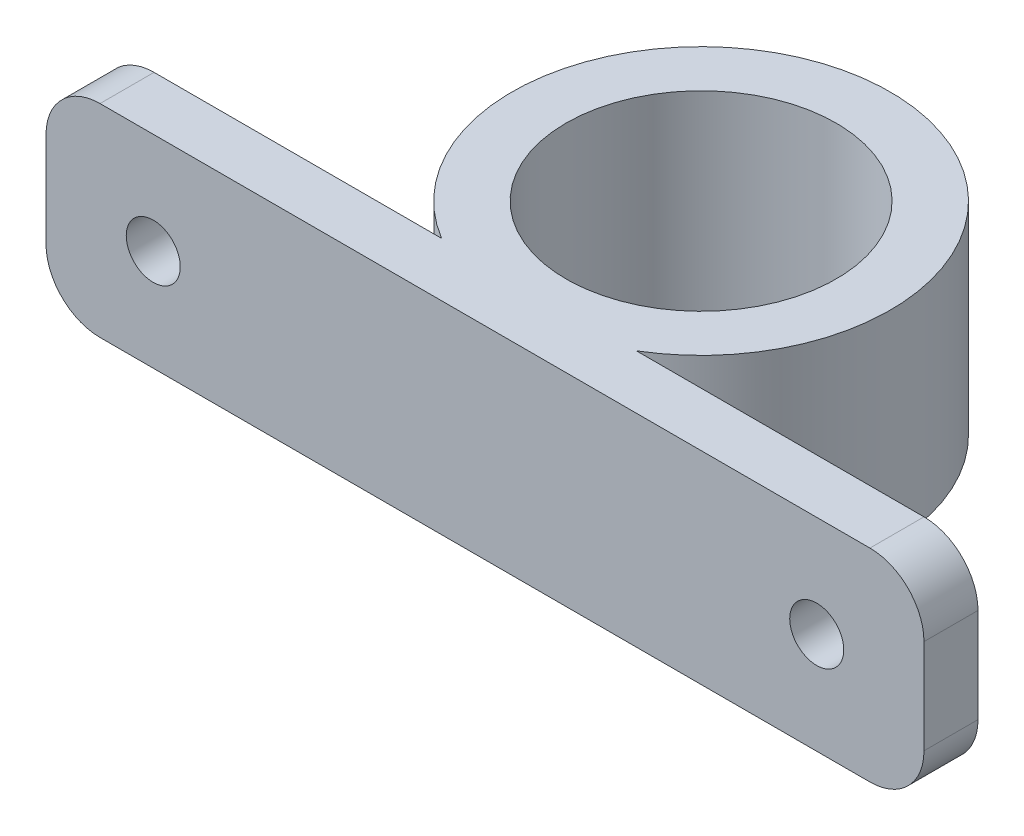
ISO-10303-21;
HEADER;
FILE_DESCRIPTION(('STEP AP214'),'2;1');
FILE_NAME('part.step','',(''),(''),'','','');
FILE_SCHEMA(('AUTOMOTIVE_DESIGN { 1 0 10303 214 1 1 1 1 }'));
ENDSEC;
DATA;
#1=APPLICATION_CONTEXT('core data for automotive mechanical design processes');
#2=APPLICATION_PROTOCOL_DEFINITION('international standard','automotive_design',2000,#1);
#3=PRODUCT_CONTEXT('',#1,'mechanical');
#4=PRODUCT('Part','Part','',(#3));
#5=PRODUCT_RELATED_PRODUCT_CATEGORY('part','',(#4));
#6=PRODUCT_DEFINITION_FORMATION('','',#4);
#7=PRODUCT_DEFINITION_CONTEXT('part definition',#1,'design');
#8=PRODUCT_DEFINITION('design','',#6,#7);
#9=PRODUCT_DEFINITION_SHAPE('','',#8);
#10=(LENGTH_UNIT() NAMED_UNIT(*) SI_UNIT(.MILLI.,.METRE.));
#11=(NAMED_UNIT(*) PLANE_ANGLE_UNIT() SI_UNIT($,.RADIAN.));
#12=(NAMED_UNIT(*) SI_UNIT($,.STERADIAN.) SOLID_ANGLE_UNIT());
#13=UNCERTAINTY_MEASURE_WITH_UNIT(LENGTH_MEASURE(1.E-05),#10,'distance_accuracy_value','');
#14=(GEOMETRIC_REPRESENTATION_CONTEXT(3) GLOBAL_UNCERTAINTY_ASSIGNED_CONTEXT((#13)) GLOBAL_UNIT_ASSIGNED_CONTEXT((#10,
#11,#12)) REPRESENTATION_CONTEXT('',''));
#15=CARTESIAN_POINT('',(0.,0.,0.));
#16=DIRECTION('',(0.,0.,1.));
#17=DIRECTION('',(1.,0.,0.));
#18=AXIS2_PLACEMENT_3D('',#15,#16,#17);
#19=CARTESIAN_POINT('',(0.,0.,0.));
#20=DIRECTION('',(0.,0.,-1.));
#21=DIRECTION('',(-1.,0.,0.));
#22=AXIS2_PLACEMENT_3D('',#19,#20,#21);
#23=PLANE('',#22);
#24=CARTESIAN_POINT('',(-12.28,0.,0.));
#25=DIRECTION('',(0.,0.,-1.));
#26=DIRECTION('',(-1.,0.,0.));
#27=AXIS2_PLACEMENT_3D('',#24,#25,#26);
#28=CIRCLE('',#27,1.);
#29=CARTESIAN_POINT('',(-13.28,0.,0.));
#30=VERTEX_POINT('',#29);
#31=EDGE_CURVE('E233',#30,#30,#28,.T.);
#32=ORIENTED_EDGE('',*,*,#31,.F.);
#33=EDGE_LOOP('',(#32));
#34=FACE_BOUND('',#33,.T.);
#35=DIRECTION('',(1.,0.,0.));
#36=VECTOR('',#35,1.);
#37=CARTESIAN_POINT('',(16.25,-3.75,0.));
#38=LINE('',#37,#36);
#39=CARTESIAN_POINT('',(-14.25,-3.75,0.));
#40=VERTEX_POINT('',#39);
#41=CARTESIAN_POINT('',(-3.60555127546398,-3.75,0.));
#42=VERTEX_POINT('',#41);
#43=EDGE_CURVE('E194',#40,#42,#38,.T.);
#44=ORIENTED_EDGE('',*,*,#43,.F.);
#45=CARTESIAN_POINT('',(-14.25,-1.75,0.));
#46=DIRECTION('',(0.,0.,-1.));
#47=DIRECTION('',(-1.,0.,0.));
#48=AXIS2_PLACEMENT_3D('',#45,#46,#47);
#49=CIRCLE('',#48,2.);
#50=CARTESIAN_POINT('',(-16.25,-1.75,0.));
#51=VERTEX_POINT('',#50);
#52=EDGE_CURVE('E54',#40,#51,#49,.T.);
#53=ORIENTED_EDGE('',*,*,#52,.T.);
#54=DIRECTION('',(0.,-1.,0.));
#55=VECTOR('',#54,1.);
#56=CARTESIAN_POINT('',(-16.25,3.75,0.));
#57=LINE('',#56,#55);
#58=CARTESIAN_POINT('',(-16.25,1.75,0.));
#59=VERTEX_POINT('',#58);
#60=EDGE_CURVE('E189',#59,#51,#57,.T.);
#61=ORIENTED_EDGE('',*,*,#60,.F.);
#62=CARTESIAN_POINT('',(-14.25,1.75,0.));
#63=DIRECTION('',(0.,0.,-1.));
#64=DIRECTION('',(-1.,0.,0.));
#65=AXIS2_PLACEMENT_3D('',#62,#63,#64);
#66=CIRCLE('',#65,2.);
#67=CARTESIAN_POINT('',(-14.25,3.75,0.));
#68=VERTEX_POINT('',#67);
#69=EDGE_CURVE('E62',#59,#68,#66,.T.);
#70=ORIENTED_EDGE('',*,*,#69,.T.);
#71=DIRECTION('',(-1.,0.,0.));
#72=VECTOR('',#71,1.);
#73=CARTESIAN_POINT('',(16.25,3.75,0.));
#74=LINE('',#73,#72);
#75=CARTESIAN_POINT('',(-3.60555127546398,3.75,0.));
#76=VERTEX_POINT('',#75);
#77=EDGE_CURVE('E130',#76,#68,#74,.T.);
#78=ORIENTED_EDGE('',*,*,#77,.F.);
#79=DIRECTION('',(0.,1.,0.));
#80=VECTOR('',#79,1.);
#81=CARTESIAN_POINT('',(-3.60555127546398,-3.75,0.));
#82=LINE('',#81,#80);
#83=EDGE_CURVE('E138',#42,#76,#82,.T.);
#84=ORIENTED_EDGE('',*,*,#83,.F.);
#85=EDGE_LOOP('',(#44,#53,#61,#70,#78,#84));
#86=FACE_BOUND('',#85,.T.);
#87=ADVANCED_FACE('F39',(#34,#86),#23,.T.);
#88=CARTESIAN_POINT('',(-16.25,3.75,2.));
#89=DIRECTION('',(1.,0.,0.));
#90=DIRECTION('',(0.,1.,0.));
#91=AXIS2_PLACEMENT_3D('',#88,#89,#90);
#92=PLANE('',#91);
#93=ORIENTED_EDGE('',*,*,#60,.T.);
#94=DIRECTION('',(0.,0.,-1.));
#95=VECTOR('',#94,1.);
#96=CARTESIAN_POINT('',(-16.25,-1.75,2.));
#97=LINE('',#96,#95);
#98=CARTESIAN_POINT('',(-16.25,-1.75,2.));
#99=VERTEX_POINT('',#98);
#100=EDGE_CURVE('E11',#51,#99,#97,.F.);
#101=ORIENTED_EDGE('',*,*,#100,.T.);
#102=DIRECTION('',(0.,-1.,0.));
#103=VECTOR('',#102,1.);
#104=CARTESIAN_POINT('',(-16.25,3.75,2.));
#105=LINE('',#104,#103);
#106=CARTESIAN_POINT('',(-16.25,1.75,2.));
#107=VERTEX_POINT('',#106);
#108=EDGE_CURVE('E129',#107,#99,#105,.T.);
#109=ORIENTED_EDGE('',*,*,#108,.F.);
#110=DIRECTION('',(0.,0.,-1.));
#111=VECTOR('',#110,1.);
#112=CARTESIAN_POINT('',(-16.25,1.75,2.));
#113=LINE('',#112,#111);
#114=EDGE_CURVE('E47',#107,#59,#113,.T.);
#115=ORIENTED_EDGE('',*,*,#114,.T.);
#116=EDGE_LOOP('',(#93,#101,#109,#115));
#117=FACE_BOUND('',#116,.T.);
#118=ADVANCED_FACE('F188',(#117),#92,.F.);
#119=CARTESIAN_POINT('',(16.25,-3.75,2.));
#120=DIRECTION('',(0.,1.,0.));
#121=DIRECTION('',(-1.,0.,0.));
#122=AXIS2_PLACEMENT_3D('',#119,#120,#121);
#123=PLANE('',#122);
#124=CARTESIAN_POINT('',(3.60555127546398,-3.75,0.));
#125=VERTEX_POINT('',#124);
#126=CARTESIAN_POINT('',(14.25,-3.75,0.));
#127=VERTEX_POINT('',#126);
#128=EDGE_CURVE('E146',#125,#127,#38,.T.);
#129=ORIENTED_EDGE('',*,*,#128,.T.);
#130=DIRECTION('',(0.,0.,-1.));
#131=VECTOR('',#130,1.);
#132=CARTESIAN_POINT('',(14.25,-3.75,2.));
#133=LINE('',#132,#131);
#134=CARTESIAN_POINT('',(14.25,-3.75,2.));
#135=VERTEX_POINT('',#134);
#136=EDGE_CURVE('E183',#127,#135,#133,.F.);
#137=ORIENTED_EDGE('',*,*,#136,.T.);
#138=DIRECTION('',(1.,0.,0.));
#139=VECTOR('',#138,1.);
#140=CARTESIAN_POINT('',(16.25,-3.75,2.));
#141=LINE('',#140,#139);
#142=CARTESIAN_POINT('',(-14.25,-3.75,2.));
#143=VERTEX_POINT('',#142);
#144=EDGE_CURVE('E221',#143,#135,#141,.T.);
#145=ORIENTED_EDGE('',*,*,#144,.F.);
#146=DIRECTION('',(0.,0.,-1.));
#147=VECTOR('',#146,1.);
#148=CARTESIAN_POINT('',(-14.25,-3.75,2.));
#149=LINE('',#148,#147);
#150=EDGE_CURVE('E180',#143,#40,#149,.T.);
#151=ORIENTED_EDGE('',*,*,#150,.T.);
#152=ORIENTED_EDGE('',*,*,#43,.T.);
#153=CARTESIAN_POINT('',(0.,-3.75,-6.));
#154=DIRECTION('',(0.,1.,0.));
#155=DIRECTION('',(-1.,0.,0.));
#156=AXIS2_PLACEMENT_3D('',#153,#154,#155);
#157=CIRCLE('',#156,7.);
#158=EDGE_CURVE('E140',#125,#42,#157,.T.);
#159=ORIENTED_EDGE('',*,*,#158,.F.);
#160=EDGE_LOOP('',(#129,#137,#145,#151,#152,#159));
#161=FACE_BOUND('',#160,.T.);
#162=CARTESIAN_POINT('',(0.,-3.75,-6.));
#163=DIRECTION('',(0.,1.,0.));
#164=DIRECTION('',(-1.,0.,0.));
#165=AXIS2_PLACEMENT_3D('',#162,#163,#164);
#166=CIRCLE('',#165,5.);
#167=CARTESIAN_POINT('',(-5.,-3.75,-6.));
#168=VERTEX_POINT('',#167);
#169=EDGE_CURVE('E141',#168,#168,#166,.T.);
#170=ORIENTED_EDGE('',*,*,#169,.T.);
#171=EDGE_LOOP('',(#170));
#172=FACE_BOUND('',#171,.T.);
#173=ADVANCED_FACE('F214',(#161,#172),#123,.F.);
#174=CARTESIAN_POINT('',(16.25,3.75,2.));
#175=DIRECTION('',(-1.,0.,0.));
#176=DIRECTION('',(0.,0.,1.));
#177=AXIS2_PLACEMENT_3D('',#174,#175,#176);
#178=PLANE('',#177);
#179=DIRECTION('',(0.,1.,0.));
#180=VECTOR('',#179,1.);
#181=CARTESIAN_POINT('',(16.25,3.75,0.));
#182=LINE('',#181,#180);
#183=CARTESIAN_POINT('',(16.25,-1.75,0.));
#184=VERTEX_POINT('',#183);
#185=CARTESIAN_POINT('',(16.25,1.75,0.));
#186=VERTEX_POINT('',#185);
#187=EDGE_CURVE('E198',#184,#186,#182,.T.);
#188=ORIENTED_EDGE('',*,*,#187,.T.);
#189=DIRECTION('',(0.,0.,-1.));
#190=VECTOR('',#189,1.);
#191=CARTESIAN_POINT('',(16.25,1.75,2.));
#192=LINE('',#191,#190);
#193=CARTESIAN_POINT('',(16.25,1.75,2.));
#194=VERTEX_POINT('',#193);
#195=EDGE_CURVE('E170',#186,#194,#192,.F.);
#196=ORIENTED_EDGE('',*,*,#195,.T.);
#197=DIRECTION('',(0.,1.,0.));
#198=VECTOR('',#197,1.);
#199=CARTESIAN_POINT('',(16.25,3.75,2.));
#200=LINE('',#199,#198);
#201=CARTESIAN_POINT('',(16.25,-1.75,2.));
#202=VERTEX_POINT('',#201);
#203=EDGE_CURVE('E152',#202,#194,#200,.T.);
#204=ORIENTED_EDGE('',*,*,#203,.F.);
#205=DIRECTION('',(0.,0.,-1.));
#206=VECTOR('',#205,1.);
#207=CARTESIAN_POINT('',(16.25,-1.75,2.));
#208=LINE('',#207,#206);
#209=EDGE_CURVE('E167',#202,#184,#208,.T.);
#210=ORIENTED_EDGE('',*,*,#209,.T.);
#211=EDGE_LOOP('',(#188,#196,#204,#210));
#212=FACE_BOUND('',#211,.T.);
#213=ADVANCED_FACE('F222',(#212),#178,.F.);
#214=CARTESIAN_POINT('',(16.25,3.75,2.));
#215=DIRECTION('',(0.,-1.,0.));
#216=DIRECTION('',(1.,0.,0.));
#217=AXIS2_PLACEMENT_3D('',#214,#215,#216);
#218=PLANE('',#217);
#219=DIRECTION('',(-1.,0.,0.));
#220=VECTOR('',#219,1.);
#221=CARTESIAN_POINT('',(16.25,3.75,2.));
#222=LINE('',#221,#220);
#223=CARTESIAN_POINT('',(14.25,3.75,2.));
#224=VERTEX_POINT('',#223);
#225=CARTESIAN_POINT('',(-14.25,3.75,2.));
#226=VERTEX_POINT('',#225);
#227=EDGE_CURVE('E147',#224,#226,#222,.T.);
#228=ORIENTED_EDGE('',*,*,#227,.F.);
#229=DIRECTION('',(0.,0.,-1.));
#230=VECTOR('',#229,1.);
#231=CARTESIAN_POINT('',(14.25,3.75,2.));
#232=LINE('',#231,#230);
#233=CARTESIAN_POINT('',(14.25,3.75,0.));
#234=VERTEX_POINT('',#233);
#235=EDGE_CURVE('E126',#224,#234,#232,.T.);
#236=ORIENTED_EDGE('',*,*,#235,.T.);
#237=CARTESIAN_POINT('',(3.60555127546398,3.75,0.));
#238=VERTEX_POINT('',#237);
#239=EDGE_CURVE('E117',#234,#238,#74,.T.);
#240=ORIENTED_EDGE('',*,*,#239,.T.);
#241=CARTESIAN_POINT('',(0.,3.75,-6.));
#242=DIRECTION('',(0.,1.,0.));
#243=DIRECTION('',(-1.,0.,0.));
#244=AXIS2_PLACEMENT_3D('',#241,#242,#243);
#245=CIRCLE('',#244,7.);
#246=EDGE_CURVE('E123',#238,#76,#245,.T.);
#247=ORIENTED_EDGE('',*,*,#246,.T.);
#248=ORIENTED_EDGE('',*,*,#77,.T.);
#249=DIRECTION('',(0.,0.,-1.));
#250=VECTOR('',#249,1.);
#251=CARTESIAN_POINT('',(-14.25,3.75,2.));
#252=LINE('',#251,#250);
#253=EDGE_CURVE('E149',#68,#226,#252,.F.);
#254=ORIENTED_EDGE('',*,*,#253,.T.);
#255=EDGE_LOOP('',(#228,#236,#240,#247,#248,#254));
#256=FACE_BOUND('',#255,.T.);
#257=CARTESIAN_POINT('',(0.,3.75,-6.));
#258=DIRECTION('',(0.,1.,0.));
#259=DIRECTION('',(-1.,0.,0.));
#260=AXIS2_PLACEMENT_3D('',#257,#258,#259);
#261=CIRCLE('',#260,5.);
#262=CARTESIAN_POINT('',(-5.,3.75,-6.));
#263=VERTEX_POINT('',#262);
#264=EDGE_CURVE('E159',#263,#263,#261,.T.);
#265=ORIENTED_EDGE('',*,*,#264,.F.);
#266=EDGE_LOOP('',(#265));
#267=FACE_BOUND('',#266,.T.);
#268=ADVANCED_FACE('F120',(#256,#267),#218,.F.);
#269=CARTESIAN_POINT('',(0.,0.,2.));
#270=DIRECTION('',(0.,0.,-1.));
#271=DIRECTION('',(-1.,0.,0.));
#272=AXIS2_PLACEMENT_3D('',#269,#270,#271);
#273=PLANE('',#272);
#274=CARTESIAN_POINT('',(12.28,0.,2.));
#275=DIRECTION('',(0.,0.,-1.));
#276=DIRECTION('',(-1.,0.,0.));
#277=AXIS2_PLACEMENT_3D('',#274,#275,#276);
#278=CIRCLE('',#277,1.);
#279=CARTESIAN_POINT('',(11.28,0.,2.));
#280=VERTEX_POINT('',#279);
#281=EDGE_CURVE('E160',#280,#280,#278,.T.);
#282=ORIENTED_EDGE('',*,*,#281,.T.);
#283=EDGE_LOOP('',(#282));
#284=FACE_BOUND('',#283,.T.);
#285=CARTESIAN_POINT('',(-12.28,0.,2.));
#286=DIRECTION('',(0.,0.,-1.));
#287=DIRECTION('',(-1.,0.,0.));
#288=AXIS2_PLACEMENT_3D('',#285,#286,#287);
#289=CIRCLE('',#288,1.);
#290=CARTESIAN_POINT('',(-13.28,0.,2.));
#291=VERTEX_POINT('',#290);
#292=EDGE_CURVE('E156',#291,#291,#289,.T.);
#293=ORIENTED_EDGE('',*,*,#292,.T.);
#294=EDGE_LOOP('',(#293));
#295=FACE_BOUND('',#294,.T.);
#296=ORIENTED_EDGE('',*,*,#203,.T.);
#297=CARTESIAN_POINT('',(14.25,1.75,2.));
#298=DIRECTION('',(0.,0.,-1.));
#299=DIRECTION('',(-1.,0.,0.));
#300=AXIS2_PLACEMENT_3D('',#297,#298,#299);
#301=CIRCLE('',#300,2.);
#302=EDGE_CURVE('E178',#194,#224,#301,.F.);
#303=ORIENTED_EDGE('',*,*,#302,.T.);
#304=ORIENTED_EDGE('',*,*,#227,.T.);
#305=CARTESIAN_POINT('',(-14.25,1.75,2.));
#306=DIRECTION('',(0.,0.,-1.));
#307=DIRECTION('',(-1.,0.,0.));
#308=AXIS2_PLACEMENT_3D('',#305,#306,#307);
#309=CIRCLE('',#308,2.);
#310=EDGE_CURVE('E172',#226,#107,#309,.F.);
#311=ORIENTED_EDGE('',*,*,#310,.T.);
#312=ORIENTED_EDGE('',*,*,#108,.T.);
#313=CARTESIAN_POINT('',(-14.25,-1.75,2.));
#314=DIRECTION('',(0.,0.,-1.));
#315=DIRECTION('',(-1.,0.,0.));
#316=AXIS2_PLACEMENT_3D('',#313,#314,#315);
#317=CIRCLE('',#316,2.);
#318=EDGE_CURVE('E174',#99,#143,#317,.F.);
#319=ORIENTED_EDGE('',*,*,#318,.T.);
#320=ORIENTED_EDGE('',*,*,#144,.T.);
#321=CARTESIAN_POINT('',(14.25,-1.75,2.));
#322=DIRECTION('',(0.,0.,-1.));
#323=DIRECTION('',(-1.,0.,0.));
#324=AXIS2_PLACEMENT_3D('',#321,#322,#323);
#325=CIRCLE('',#324,2.);
#326=EDGE_CURVE('E176',#135,#202,#325,.F.);
#327=ORIENTED_EDGE('',*,*,#326,.T.);
#328=EDGE_LOOP('',(#296,#303,#304,#311,#312,#319,#320,#327));
#329=FACE_BOUND('',#328,.T.);
#330=ADVANCED_FACE('F205',(#284,#295,#329),#273,.F.);
#331=CARTESIAN_POINT('',(12.28,0.,0.));
#332=DIRECTION('',(0.,0.,-1.));
#333=DIRECTION('',(-1.,0.,0.));
#334=AXIS2_PLACEMENT_3D('',#331,#332,#333);
#335=CIRCLE('',#334,1.);
#336=CARTESIAN_POINT('',(11.28,0.,0.));
#337=VERTEX_POINT('',#336);
#338=EDGE_CURVE('E232',#337,#337,#335,.T.);
#339=ORIENTED_EDGE('',*,*,#338,.F.);
#340=EDGE_LOOP('',(#339));
#341=FACE_BOUND('',#340,.T.);
#342=ORIENTED_EDGE('',*,*,#239,.F.);
#343=CARTESIAN_POINT('',(14.25,1.75,0.));
#344=DIRECTION('',(0.,0.,-1.));
#345=DIRECTION('',(-1.,0.,0.));
#346=AXIS2_PLACEMENT_3D('',#343,#344,#345);
#347=CIRCLE('',#346,2.);
#348=EDGE_CURVE('E165',#234,#186,#347,.T.);
#349=ORIENTED_EDGE('',*,*,#348,.T.);
#350=ORIENTED_EDGE('',*,*,#187,.F.);
#351=CARTESIAN_POINT('',(14.25,-1.75,0.));
#352=DIRECTION('',(0.,0.,-1.));
#353=DIRECTION('',(-1.,0.,0.));
#354=AXIS2_PLACEMENT_3D('',#351,#352,#353);
#355=CIRCLE('',#354,2.);
#356=EDGE_CURVE('E163',#184,#127,#355,.T.);
#357=ORIENTED_EDGE('',*,*,#356,.T.);
#358=ORIENTED_EDGE('',*,*,#128,.F.);
#359=DIRECTION('',(0.,1.,0.));
#360=VECTOR('',#359,1.);
#361=CARTESIAN_POINT('',(3.60555127546398,-3.75,0.));
#362=LINE('',#361,#360);
#363=EDGE_CURVE('E135',#238,#125,#362,.F.);
#364=ORIENTED_EDGE('',*,*,#363,.F.);
#365=EDGE_LOOP('',(#342,#349,#350,#357,#358,#364));
#366=FACE_BOUND('',#365,.T.);
#367=ADVANCED_FACE('F144',(#341,#366),#23,.T.);
#368=CARTESIAN_POINT('',(0.,-3.75,-6.));
#369=DIRECTION('',(0.,1.,0.));
#370=DIRECTION('',(-1.,0.,0.));
#371=AXIS2_PLACEMENT_3D('',#368,#369,#370);
#372=CYLINDRICAL_SURFACE('',#371,7.);
#373=ORIENTED_EDGE('',*,*,#158,.T.);
#374=ORIENTED_EDGE('',*,*,#83,.T.);
#375=ORIENTED_EDGE('',*,*,#246,.F.);
#376=ORIENTED_EDGE('',*,*,#363,.T.);
#377=EDGE_LOOP('',(#373,#374,#375,#376));
#378=FACE_BOUND('',#377,.T.);
#379=ADVANCED_FACE('F134',(#378),#372,.T.);
#380=CARTESIAN_POINT('',(0.,-3.75,-6.));
#381=DIRECTION('',(0.,1.,0.));
#382=DIRECTION('',(-1.,0.,0.));
#383=AXIS2_PLACEMENT_3D('',#380,#381,#382);
#384=CYLINDRICAL_SURFACE('',#383,5.);
#385=ORIENTED_EDGE('',*,*,#169,.F.);
#386=EDGE_LOOP('',(#385));
#387=FACE_BOUND('',#386,.T.);
#388=ORIENTED_EDGE('',*,*,#264,.T.);
#389=EDGE_LOOP('',(#388));
#390=FACE_BOUND('',#389,.T.);
#391=ADVANCED_FACE('F248',(#387,#390),#384,.F.);
#392=CARTESIAN_POINT('',(12.28,0.,3.18));
#393=DIRECTION('',(0.,0.,-1.));
#394=DIRECTION('',(-1.,0.,0.));
#395=AXIS2_PLACEMENT_3D('',#392,#393,#394);
#396=CYLINDRICAL_SURFACE('',#395,1.);
#397=CARTESIAN_POINT('',(11.28,0.,0.));
#398=CARTESIAN_POINT('',(11.28,0.,0.0208333333333333));
#399=CARTESIAN_POINT('',(11.28,0.,0.0416666666666667));
#400=CARTESIAN_POINT('',(11.28,0.,0.0833333333333334));
#401=CARTESIAN_POINT('',(11.28,0.,0.104166666666667));
#402=CARTESIAN_POINT('',(11.28,0.,0.145833333333333));
#403=CARTESIAN_POINT('',(11.28,0.,0.166666666666667));
#404=CARTESIAN_POINT('',(11.28,0.,0.208333333333334));
#405=CARTESIAN_POINT('',(11.28,0.,0.229166666666667));
#406=CARTESIAN_POINT('',(11.28,0.,0.270833333333334));
#407=CARTESIAN_POINT('',(11.28,0.,0.291666666666667));
#408=CARTESIAN_POINT('',(11.28,0.,0.333333333333334));
#409=CARTESIAN_POINT('',(11.28,0.,0.354166666666667));
#410=CARTESIAN_POINT('',(11.28,0.,0.395833333333334));
#411=CARTESIAN_POINT('',(11.28,0.,0.416666666666667));
#412=CARTESIAN_POINT('',(11.28,0.,0.458333333333333));
#413=CARTESIAN_POINT('',(11.28,0.,0.479166666666667));
#414=CARTESIAN_POINT('',(11.28,0.,0.520833333333333));
#415=CARTESIAN_POINT('',(11.28,0.,0.541666666666667));
#416=CARTESIAN_POINT('',(11.28,0.,0.583333333333333));
#417=CARTESIAN_POINT('',(11.28,0.,0.604166666666667));
#418=CARTESIAN_POINT('',(11.28,0.,0.645833333333333));
#419=CARTESIAN_POINT('',(11.28,0.,0.666666666666667));
#420=CARTESIAN_POINT('',(11.28,0.,0.708333333333333));
#421=CARTESIAN_POINT('',(11.28,0.,0.729166666666667));
#422=CARTESIAN_POINT('',(11.28,0.,0.770833333333334));
#423=CARTESIAN_POINT('',(11.28,0.,0.791666666666667));
#424=CARTESIAN_POINT('',(11.28,0.,0.833333333333334));
#425=CARTESIAN_POINT('',(11.28,0.,0.854166666666667));
#426=CARTESIAN_POINT('',(11.28,0.,0.895833333333334));
#427=CARTESIAN_POINT('',(11.28,0.,0.916666666666667));
#428=CARTESIAN_POINT('',(11.28,0.,0.958333333333333));
#429=CARTESIAN_POINT('',(11.28,0.,0.979166666666667));
#430=CARTESIAN_POINT('',(11.28,0.,1.02083333333333));
#431=CARTESIAN_POINT('',(11.28,0.,1.04166666666667));
#432=CARTESIAN_POINT('',(11.28,0.,1.08333333333333));
#433=CARTESIAN_POINT('',(11.28,0.,1.10416666666667));
#434=CARTESIAN_POINT('',(11.28,0.,1.14583333333333));
#435=CARTESIAN_POINT('',(11.28,0.,1.16666666666667));
#436=CARTESIAN_POINT('',(11.28,0.,1.20833333333333));
#437=CARTESIAN_POINT('',(11.28,0.,1.22916666666667));
#438=CARTESIAN_POINT('',(11.28,0.,1.27083333333333));
#439=CARTESIAN_POINT('',(11.28,0.,1.29166666666667));
#440=CARTESIAN_POINT('',(11.28,0.,1.33333333333333));
#441=CARTESIAN_POINT('',(11.28,0.,1.35416666666667));
#442=CARTESIAN_POINT('',(11.28,0.,1.39583333333333));
#443=CARTESIAN_POINT('',(11.28,0.,1.41666666666667));
#444=CARTESIAN_POINT('',(11.28,0.,1.45833333333333));
#445=CARTESIAN_POINT('',(11.28,0.,1.47916666666667));
#446=CARTESIAN_POINT('',(11.28,0.,1.52083333333333));
#447=CARTESIAN_POINT('',(11.28,0.,1.54166666666667));
#448=CARTESIAN_POINT('',(11.28,0.,1.58333333333333));
#449=CARTESIAN_POINT('',(11.28,0.,1.60416666666667));
#450=CARTESIAN_POINT('',(11.28,0.,1.64583333333333));
#451=CARTESIAN_POINT('',(11.28,0.,1.66666666666667));
#452=CARTESIAN_POINT('',(11.28,0.,1.70833333333333));
#453=CARTESIAN_POINT('',(11.28,0.,1.72916666666667));
#454=CARTESIAN_POINT('',(11.28,0.,1.77083333333333));
#455=CARTESIAN_POINT('',(11.28,0.,1.79166666666667));
#456=CARTESIAN_POINT('',(11.28,0.,1.83333333333333));
#457=CARTESIAN_POINT('',(11.28,0.,1.85416666666667));
#458=CARTESIAN_POINT('',(11.28,0.,1.89583333333333));
#459=CARTESIAN_POINT('',(11.28,0.,1.91666666666667));
#460=CARTESIAN_POINT('',(11.28,0.,1.95833333333333));
#461=CARTESIAN_POINT('',(11.28,0.,1.97916666666667));
#462=CARTESIAN_POINT('',(11.28,0.,2.));
#463=B_SPLINE_CURVE_WITH_KNOTS('',3,(#397,#398,#399,#400,#401,#402,#403,#404,#405,#406,#407,
#408,#409,#410,#411,#412,#413,#414,#415,#416,#417,#418,#419,#420,#421,#422,#423,#424,#425,#426,
#427,#428,#429,#430,#431,#432,#433,#434,#435,#436,#437,#438,#439,#440,#441,#442,#443,#444,#445,
#446,#447,#448,#449,#450,#451,#452,#453,#454,#455,#456,#457,#458,#459,#460,#461,#462),
.UNSPECIFIED.,.F.,.F.,(4,2,2,2,2,2,2,2,2,2,2,2,2,2,2,2,2,2,2,2,2,2,2,2,2,2,2,2,2,2,2,2,4),(0.,
0.0625000000000001,0.125,0.1875,0.25,0.3125,0.375,0.4375,0.5,0.5625,0.625,0.6875,0.75,0.8125,
0.875,0.9375,1.,1.0625,1.125,1.1875,1.25,1.3125,1.375,1.4375,1.5,1.5625,1.625,1.6875,1.75,
1.8125,1.875,1.9375,2.),.UNSPECIFIED.);
#464=EDGE_CURVE('BSEAM239',#337,#280,#463,.T.);
#465=ORIENTED_EDGE('',*,*,#338,.T.);
#466=ORIENTED_EDGE('',*,*,#281,.F.);
#467=ORIENTED_EDGE('',*,*,#464,.T.);
#468=ORIENTED_EDGE('',*,*,#464,.F.);
#469=EDGE_LOOP('',(#465,#467,#466,#468));
#470=FACE_BOUND('',#469,.T.);
#471=ADVANCED_FACE('F239',(#470),#396,.F.);
#472=CARTESIAN_POINT('',(-12.28,0.,3.18));
#473=DIRECTION('',(0.,0.,-1.));
#474=DIRECTION('',(-1.,0.,0.));
#475=AXIS2_PLACEMENT_3D('',#472,#473,#474);
#476=CYLINDRICAL_SURFACE('',#475,1.);
#477=CARTESIAN_POINT('',(-13.28,0.,0.));
#478=CARTESIAN_POINT('',(-13.28,0.,0.0208333333333333));
#479=CARTESIAN_POINT('',(-13.28,0.,0.0416666666666667));
#480=CARTESIAN_POINT('',(-13.28,0.,0.0833333333333334));
#481=CARTESIAN_POINT('',(-13.28,0.,0.104166666666667));
#482=CARTESIAN_POINT('',(-13.28,0.,0.145833333333333));
#483=CARTESIAN_POINT('',(-13.28,0.,0.166666666666667));
#484=CARTESIAN_POINT('',(-13.28,0.,0.208333333333334));
#485=CARTESIAN_POINT('',(-13.28,0.,0.229166666666667));
#486=CARTESIAN_POINT('',(-13.28,0.,0.270833333333334));
#487=CARTESIAN_POINT('',(-13.28,0.,0.291666666666667));
#488=CARTESIAN_POINT('',(-13.28,0.,0.333333333333334));
#489=CARTESIAN_POINT('',(-13.28,0.,0.354166666666667));
#490=CARTESIAN_POINT('',(-13.28,0.,0.395833333333334));
#491=CARTESIAN_POINT('',(-13.28,0.,0.416666666666667));
#492=CARTESIAN_POINT('',(-13.28,0.,0.458333333333333));
#493=CARTESIAN_POINT('',(-13.28,0.,0.479166666666667));
#494=CARTESIAN_POINT('',(-13.28,0.,0.520833333333333));
#495=CARTESIAN_POINT('',(-13.28,0.,0.541666666666667));
#496=CARTESIAN_POINT('',(-13.28,0.,0.583333333333333));
#497=CARTESIAN_POINT('',(-13.28,0.,0.604166666666667));
#498=CARTESIAN_POINT('',(-13.28,0.,0.645833333333333));
#499=CARTESIAN_POINT('',(-13.28,0.,0.666666666666667));
#500=CARTESIAN_POINT('',(-13.28,0.,0.708333333333333));
#501=CARTESIAN_POINT('',(-13.28,0.,0.729166666666667));
#502=CARTESIAN_POINT('',(-13.28,0.,0.770833333333334));
#503=CARTESIAN_POINT('',(-13.28,0.,0.791666666666667));
#504=CARTESIAN_POINT('',(-13.28,0.,0.833333333333334));
#505=CARTESIAN_POINT('',(-13.28,0.,0.854166666666667));
#506=CARTESIAN_POINT('',(-13.28,0.,0.895833333333334));
#507=CARTESIAN_POINT('',(-13.28,0.,0.916666666666667));
#508=CARTESIAN_POINT('',(-13.28,0.,0.958333333333333));
#509=CARTESIAN_POINT('',(-13.28,0.,0.979166666666667));
#510=CARTESIAN_POINT('',(-13.28,0.,1.02083333333333));
#511=CARTESIAN_POINT('',(-13.28,0.,1.04166666666667));
#512=CARTESIAN_POINT('',(-13.28,0.,1.08333333333333));
#513=CARTESIAN_POINT('',(-13.28,0.,1.10416666666667));
#514=CARTESIAN_POINT('',(-13.28,0.,1.14583333333333));
#515=CARTESIAN_POINT('',(-13.28,0.,1.16666666666667));
#516=CARTESIAN_POINT('',(-13.28,0.,1.20833333333333));
#517=CARTESIAN_POINT('',(-13.28,0.,1.22916666666667));
#518=CARTESIAN_POINT('',(-13.28,0.,1.27083333333333));
#519=CARTESIAN_POINT('',(-13.28,0.,1.29166666666667));
#520=CARTESIAN_POINT('',(-13.28,0.,1.33333333333333));
#521=CARTESIAN_POINT('',(-13.28,0.,1.35416666666667));
#522=CARTESIAN_POINT('',(-13.28,0.,1.39583333333333));
#523=CARTESIAN_POINT('',(-13.28,0.,1.41666666666667));
#524=CARTESIAN_POINT('',(-13.28,0.,1.45833333333333));
#525=CARTESIAN_POINT('',(-13.28,0.,1.47916666666667));
#526=CARTESIAN_POINT('',(-13.28,0.,1.52083333333333));
#527=CARTESIAN_POINT('',(-13.28,0.,1.54166666666667));
#528=CARTESIAN_POINT('',(-13.28,0.,1.58333333333333));
#529=CARTESIAN_POINT('',(-13.28,0.,1.60416666666667));
#530=CARTESIAN_POINT('',(-13.28,0.,1.64583333333333));
#531=CARTESIAN_POINT('',(-13.28,0.,1.66666666666667));
#532=CARTESIAN_POINT('',(-13.28,0.,1.70833333333333));
#533=CARTESIAN_POINT('',(-13.28,0.,1.72916666666667));
#534=CARTESIAN_POINT('',(-13.28,0.,1.77083333333333));
#535=CARTESIAN_POINT('',(-13.28,0.,1.79166666666667));
#536=CARTESIAN_POINT('',(-13.28,0.,1.83333333333333));
#537=CARTESIAN_POINT('',(-13.28,0.,1.85416666666667));
#538=CARTESIAN_POINT('',(-13.28,0.,1.89583333333333));
#539=CARTESIAN_POINT('',(-13.28,0.,1.91666666666667));
#540=CARTESIAN_POINT('',(-13.28,0.,1.95833333333333));
#541=CARTESIAN_POINT('',(-13.28,0.,1.97916666666667));
#542=CARTESIAN_POINT('',(-13.28,0.,2.));
#543=B_SPLINE_CURVE_WITH_KNOTS('',3,(#477,#478,#479,#480,#481,#482,#483,#484,#485,#486,#487,
#488,#489,#490,#491,#492,#493,#494,#495,#496,#497,#498,#499,#500,#501,#502,#503,#504,#505,#506,
#507,#508,#509,#510,#511,#512,#513,#514,#515,#516,#517,#518,#519,#520,#521,#522,#523,#524,#525,
#526,#527,#528,#529,#530,#531,#532,#533,#534,#535,#536,#537,#538,#539,#540,#541,#542),
.UNSPECIFIED.,.F.,.F.,(4,2,2,2,2,2,2,2,2,2,2,2,2,2,2,2,2,2,2,2,2,2,2,2,2,2,2,2,2,2,2,2,4),(0.,
0.0625000000000001,0.125,0.1875,0.25,0.3125,0.375,0.4375,0.5,0.5625,0.625,0.6875,0.75,0.8125,
0.875,0.9375,1.,1.0625,1.125,1.1875,1.25,1.3125,1.375,1.4375,1.5,1.5625,1.625,1.6875,1.75,
1.8125,1.875,1.9375,2.),.UNSPECIFIED.);
#544=EDGE_CURVE('BSEAM261',#30,#291,#543,.T.);
#545=ORIENTED_EDGE('',*,*,#31,.T.);
#546=ORIENTED_EDGE('',*,*,#292,.F.);
#547=ORIENTED_EDGE('',*,*,#544,.T.);
#548=ORIENTED_EDGE('',*,*,#544,.F.);
#549=EDGE_LOOP('',(#545,#547,#546,#548));
#550=FACE_BOUND('',#549,.T.);
#551=ADVANCED_FACE('F261',(#550),#476,.F.);
#552=CARTESIAN_POINT('',(14.25,1.75,2.));
#553=DIRECTION('',(0.,0.,-1.));
#554=DIRECTION('',(-1.,0.,0.));
#555=AXIS2_PLACEMENT_3D('',#552,#553,#554);
#556=CYLINDRICAL_SURFACE('',#555,2.);
#557=ORIENTED_EDGE('',*,*,#302,.F.);
#558=ORIENTED_EDGE('',*,*,#195,.F.);
#559=ORIENTED_EDGE('',*,*,#348,.F.);
#560=ORIENTED_EDGE('',*,*,#235,.F.);
#561=EDGE_LOOP('',(#557,#558,#559,#560));
#562=FACE_BOUND('',#561,.T.);
#563=ADVANCED_FACE('F209',(#562),#556,.T.);
#564=CARTESIAN_POINT('',(14.25,-1.75,2.));
#565=DIRECTION('',(0.,0.,-1.));
#566=DIRECTION('',(-1.,0.,0.));
#567=AXIS2_PLACEMENT_3D('',#564,#565,#566);
#568=CYLINDRICAL_SURFACE('',#567,2.);
#569=ORIENTED_EDGE('',*,*,#326,.F.);
#570=ORIENTED_EDGE('',*,*,#136,.F.);
#571=ORIENTED_EDGE('',*,*,#356,.F.);
#572=ORIENTED_EDGE('',*,*,#209,.F.);
#573=EDGE_LOOP('',(#569,#570,#571,#572));
#574=FACE_BOUND('',#573,.T.);
#575=ADVANCED_FACE('F219',(#574),#568,.T.);
#576=CARTESIAN_POINT('',(-14.25,-1.75,2.));
#577=DIRECTION('',(0.,0.,-1.));
#578=DIRECTION('',(-1.,0.,0.));
#579=AXIS2_PLACEMENT_3D('',#576,#577,#578);
#580=CYLINDRICAL_SURFACE('',#579,2.);
#581=ORIENTED_EDGE('',*,*,#318,.F.);
#582=ORIENTED_EDGE('',*,*,#100,.F.);
#583=ORIENTED_EDGE('',*,*,#52,.F.);
#584=ORIENTED_EDGE('',*,*,#150,.F.);
#585=EDGE_LOOP('',(#581,#582,#583,#584));
#586=FACE_BOUND('',#585,.T.);
#587=ADVANCED_FACE('F290',(#586),#580,.T.);
#588=CARTESIAN_POINT('',(-14.25,1.75,2.));
#589=DIRECTION('',(0.,0.,-1.));
#590=DIRECTION('',(-1.,0.,0.));
#591=AXIS2_PLACEMENT_3D('',#588,#589,#590);
#592=CYLINDRICAL_SURFACE('',#591,2.);
#593=ORIENTED_EDGE('',*,*,#310,.F.);
#594=ORIENTED_EDGE('',*,*,#253,.F.);
#595=ORIENTED_EDGE('',*,*,#69,.F.);
#596=ORIENTED_EDGE('',*,*,#114,.F.);
#597=EDGE_LOOP('',(#593,#594,#595,#596));
#598=FACE_BOUND('',#597,.T.);
#599=ADVANCED_FACE('F41',(#598),#592,.T.);
#600=CLOSED_SHELL('',(#87,#118,#173,#213,#268,#330,#367,#379,#391,#471,#551,#563,#575,#587,#599));
#601=MANIFOLD_SOLID_BREP('B2',#600);
#602=ADVANCED_BREP_SHAPE_REPRESENTATION('',(#18,#601),#14);
#603=SHAPE_DEFINITION_REPRESENTATION(#9,#602);
ENDSEC;
END-ISO-10303-21;
